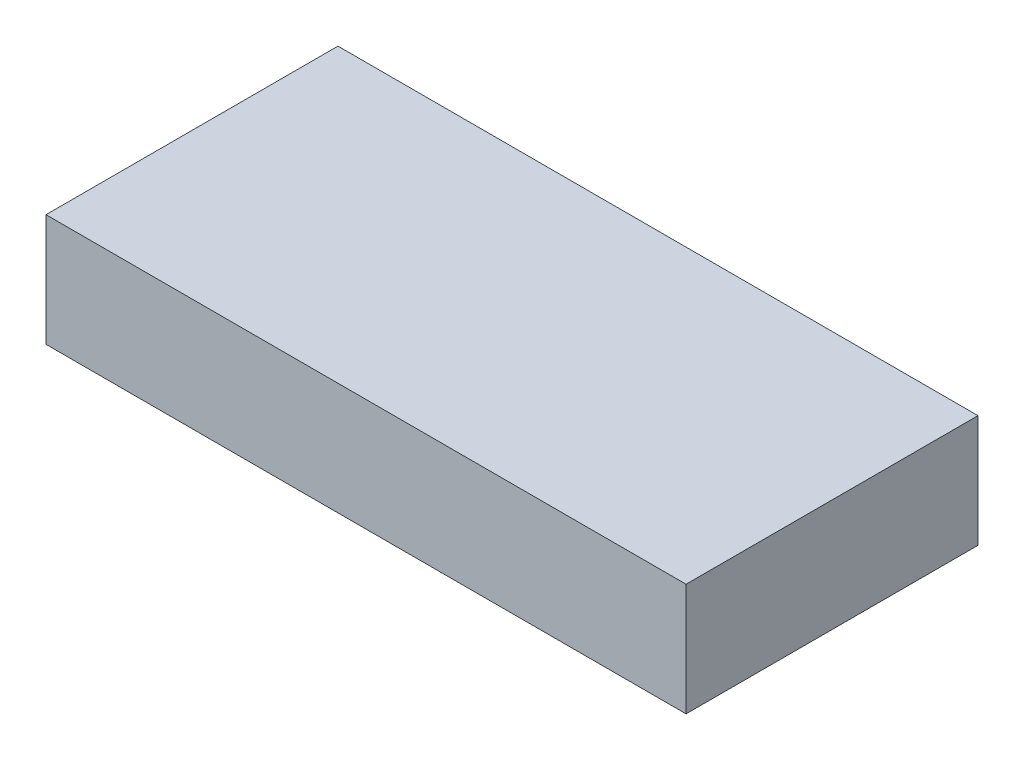
ISO-10303-21;
HEADER;
FILE_DESCRIPTION(('STEP AP214'),'2;1');
FILE_NAME('part.step','',(''),(''),'','','');
FILE_SCHEMA(('AUTOMOTIVE_DESIGN { 1 0 10303 214 1 1 1 1 }'));
ENDSEC;
DATA;
#1=APPLICATION_CONTEXT('core data for automotive mechanical design processes');
#2=APPLICATION_PROTOCOL_DEFINITION('international standard','automotive_design',2000,#1);
#3=PRODUCT_CONTEXT('',#1,'mechanical');
#4=PRODUCT('Part','Part','',(#3));
#5=PRODUCT_RELATED_PRODUCT_CATEGORY('part','',(#4));
#6=PRODUCT_DEFINITION_FORMATION('','',#4);
#7=PRODUCT_DEFINITION_CONTEXT('part definition',#1,'design');
#8=PRODUCT_DEFINITION('design','',#6,#7);
#9=PRODUCT_DEFINITION_SHAPE('','',#8);
#10=(LENGTH_UNIT() NAMED_UNIT(*) SI_UNIT(.MILLI.,.METRE.));
#11=(NAMED_UNIT(*) PLANE_ANGLE_UNIT() SI_UNIT($,.RADIAN.));
#12=(NAMED_UNIT(*) SI_UNIT($,.STERADIAN.) SOLID_ANGLE_UNIT());
#13=UNCERTAINTY_MEASURE_WITH_UNIT(LENGTH_MEASURE(1.E-05),#10,'distance_accuracy_value','');
#14=(GEOMETRIC_REPRESENTATION_CONTEXT(3) GLOBAL_UNCERTAINTY_ASSIGNED_CONTEXT((#13)) GLOBAL_UNIT_ASSIGNED_CONTEXT((#10,
#11,#12)) REPRESENTATION_CONTEXT('',''));
#15=CARTESIAN_POINT('',(0.,0.,0.));
#16=DIRECTION('',(0.,0.,1.));
#17=DIRECTION('',(1.,0.,0.));
#18=AXIS2_PLACEMENT_3D('',#15,#16,#17);
#19=CARTESIAN_POINT('',(14.25,2.5,6.5));
#20=DIRECTION('',(-1.,0.,0.));
#21=DIRECTION('',(0.,0.,1.));
#22=AXIS2_PLACEMENT_3D('',#19,#20,#21);
#23=PLANE('',#22);
#24=DIRECTION('',(0.,0.,-1.));
#25=VECTOR('',#24,1.);
#26=CARTESIAN_POINT('',(14.25,-2.5,6.5));
#27=LINE('',#26,#25);
#28=CARTESIAN_POINT('',(14.25,-2.5,6.5));
#29=VERTEX_POINT('',#28);
#30=CARTESIAN_POINT('',(14.25,-2.5,-6.5));
#31=VERTEX_POINT('',#30);
#32=EDGE_CURVE('E104',#29,#31,#27,.T.);
#33=ORIENTED_EDGE('',*,*,#32,.T.);
#34=DIRECTION('',(0.,-1.,0.));
#35=VECTOR('',#34,1.);
#36=CARTESIAN_POINT('',(14.25,2.5,-6.5));
#37=LINE('',#36,#35);
#38=CARTESIAN_POINT('',(14.25,2.5,-6.5));
#39=VERTEX_POINT('',#38);
#40=EDGE_CURVE('E11',#39,#31,#37,.T.);
#41=ORIENTED_EDGE('',*,*,#40,.F.);
#42=DIRECTION('',(0.,0.,-1.));
#43=VECTOR('',#42,1.);
#44=CARTESIAN_POINT('',(14.25,2.5,6.5));
#45=LINE('',#44,#43);
#46=CARTESIAN_POINT('',(14.25,2.5,6.5));
#47=VERTEX_POINT('',#46);
#48=EDGE_CURVE('E92',#47,#39,#45,.T.);
#49=ORIENTED_EDGE('',*,*,#48,.F.);
#50=DIRECTION('',(0.,-1.,0.));
#51=VECTOR('',#50,1.);
#52=CARTESIAN_POINT('',(14.25,2.5,6.5));
#53=LINE('',#52,#51);
#54=EDGE_CURVE('E100',#47,#29,#53,.T.);
#55=ORIENTED_EDGE('',*,*,#54,.T.);
#56=EDGE_LOOP('',(#33,#41,#49,#55));
#57=FACE_BOUND('',#56,.T.);
#58=ADVANCED_FACE('F41',(#57),#23,.F.);
#59=CARTESIAN_POINT('',(-14.25,2.5,-6.5));
#60=DIRECTION('',(0.,0.,1.));
#61=DIRECTION('',(1.,0.,0.));
#62=AXIS2_PLACEMENT_3D('',#59,#60,#61);
#63=PLANE('',#62);
#64=DIRECTION('',(-1.,0.,0.));
#65=VECTOR('',#64,1.);
#66=CARTESIAN_POINT('',(-14.25,-2.5,-6.5));
#67=LINE('',#66,#65);
#68=CARTESIAN_POINT('',(-14.25,-2.5,-6.5));
#69=VERTEX_POINT('',#68);
#70=EDGE_CURVE('E96',#31,#69,#67,.T.);
#71=ORIENTED_EDGE('',*,*,#70,.T.);
#72=DIRECTION('',(0.,-1.,0.));
#73=VECTOR('',#72,1.);
#74=CARTESIAN_POINT('',(-14.25,2.5,-6.5));
#75=LINE('',#74,#73);
#76=CARTESIAN_POINT('',(-14.25,2.5,-6.5));
#77=VERTEX_POINT('',#76);
#78=EDGE_CURVE('E49',#77,#69,#75,.T.);
#79=ORIENTED_EDGE('',*,*,#78,.F.);
#80=DIRECTION('',(-1.,0.,0.));
#81=VECTOR('',#80,1.);
#82=CARTESIAN_POINT('',(-14.25,2.5,-6.5));
#83=LINE('',#82,#81);
#84=EDGE_CURVE('E87',#39,#77,#83,.T.);
#85=ORIENTED_EDGE('',*,*,#84,.F.);
#86=ORIENTED_EDGE('',*,*,#40,.T.);
#87=EDGE_LOOP('',(#71,#79,#85,#86));
#88=FACE_BOUND('',#87,.T.);
#89=ADVANCED_FACE('F95',(#88),#63,.F.);
#90=CARTESIAN_POINT('',(-14.25,2.5,6.5));
#91=DIRECTION('',(1.,0.,0.));
#92=DIRECTION('',(0.,0.,-1.));
#93=AXIS2_PLACEMENT_3D('',#90,#91,#92);
#94=PLANE('',#93);
#95=DIRECTION('',(0.,0.,1.));
#96=VECTOR('',#95,1.);
#97=CARTESIAN_POINT('',(-14.25,-2.5,6.5));
#98=LINE('',#97,#96);
#99=CARTESIAN_POINT('',(-14.25,-2.5,6.5));
#100=VERTEX_POINT('',#99);
#101=EDGE_CURVE('E74',#69,#100,#98,.T.);
#102=ORIENTED_EDGE('',*,*,#101,.T.);
#103=DIRECTION('',(0.,-1.,0.));
#104=VECTOR('',#103,1.);
#105=CARTESIAN_POINT('',(-14.25,2.5,6.5));
#106=LINE('',#105,#104);
#107=CARTESIAN_POINT('',(-14.25,2.5,6.5));
#108=VERTEX_POINT('',#107);
#109=EDGE_CURVE('E97',#108,#100,#106,.T.);
#110=ORIENTED_EDGE('',*,*,#109,.F.);
#111=DIRECTION('',(0.,0.,1.));
#112=VECTOR('',#111,1.);
#113=CARTESIAN_POINT('',(-14.25,2.5,6.5));
#114=LINE('',#113,#112);
#115=EDGE_CURVE('E90',#77,#108,#114,.T.);
#116=ORIENTED_EDGE('',*,*,#115,.F.);
#117=ORIENTED_EDGE('',*,*,#78,.T.);
#118=EDGE_LOOP('',(#102,#110,#116,#117));
#119=FACE_BOUND('',#118,.T.);
#120=ADVANCED_FACE('F98',(#119),#94,.F.);
#121=CARTESIAN_POINT('',(-14.25,2.5,6.5));
#122=DIRECTION('',(0.,0.,-1.));
#123=DIRECTION('',(-1.,0.,0.));
#124=AXIS2_PLACEMENT_3D('',#121,#122,#123);
#125=PLANE('',#124);
#126=DIRECTION('',(1.,0.,0.));
#127=VECTOR('',#126,1.);
#128=CARTESIAN_POINT('',(-14.25,-2.5,6.5));
#129=LINE('',#128,#127);
#130=EDGE_CURVE('E80',#100,#29,#129,.T.);
#131=ORIENTED_EDGE('',*,*,#130,.T.);
#132=ORIENTED_EDGE('',*,*,#54,.F.);
#133=DIRECTION('',(1.,0.,0.));
#134=VECTOR('',#133,1.);
#135=CARTESIAN_POINT('',(-14.25,2.5,6.5));
#136=LINE('',#135,#134);
#137=EDGE_CURVE('E57',#108,#47,#136,.T.);
#138=ORIENTED_EDGE('',*,*,#137,.F.);
#139=ORIENTED_EDGE('',*,*,#109,.T.);
#140=EDGE_LOOP('',(#131,#132,#138,#139));
#141=FACE_BOUND('',#140,.T.);
#142=ADVANCED_FACE('F111',(#141),#125,.F.);
#143=CARTESIAN_POINT('',(0.,2.5,0.));
#144=DIRECTION('',(0.,-1.,0.));
#145=DIRECTION('',(0.,0.,-1.));
#146=AXIS2_PLACEMENT_3D('',#143,#144,#145);
#147=PLANE('',#146);
#148=ORIENTED_EDGE('',*,*,#48,.T.);
#149=ORIENTED_EDGE('',*,*,#84,.T.);
#150=ORIENTED_EDGE('',*,*,#115,.T.);
#151=ORIENTED_EDGE('',*,*,#137,.T.);
#152=EDGE_LOOP('',(#148,#149,#150,#151));
#153=FACE_BOUND('',#152,.T.);
#154=ADVANCED_FACE('F88',(#153),#147,.F.);
#155=CARTESIAN_POINT('',(0.,-2.5,0.));
#156=DIRECTION('',(0.,-1.,0.));
#157=DIRECTION('',(0.,0.,-1.));
#158=AXIS2_PLACEMENT_3D('',#155,#156,#157);
#159=PLANE('',#158);
#160=ORIENTED_EDGE('',*,*,#32,.F.);
#161=ORIENTED_EDGE('',*,*,#130,.F.);
#162=ORIENTED_EDGE('',*,*,#101,.F.);
#163=ORIENTED_EDGE('',*,*,#70,.F.);
#164=EDGE_LOOP('',(#160,#161,#162,#163));
#165=FACE_BOUND('',#164,.T.);
#166=ADVANCED_FACE('F114',(#165),#159,.T.);
#167=CLOSED_SHELL('',(#58,#89,#120,#142,#154,#166));
#168=MANIFOLD_SOLID_BREP('B2',#167);
#169=ADVANCED_BREP_SHAPE_REPRESENTATION('',(#18,#168),#14);
#170=SHAPE_DEFINITION_REPRESENTATION(#9,#169);
ENDSEC;
END-ISO-10303-21;
